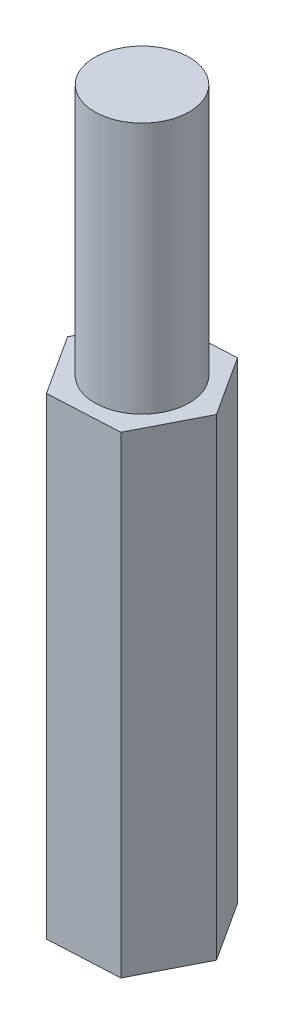
ISO-10303-21;
HEADER;
FILE_DESCRIPTION(('STEP AP214'),'2;1');
FILE_NAME('part.step','',(''),(''),'','','');
FILE_SCHEMA(('AUTOMOTIVE_DESIGN { 1 0 10303 214 1 1 1 1 }'));
ENDSEC;
DATA;
#1=APPLICATION_CONTEXT('core data for automotive mechanical design processes');
#2=APPLICATION_PROTOCOL_DEFINITION('international standard','automotive_design',2000,#1);
#3=PRODUCT_CONTEXT('',#1,'mechanical');
#4=PRODUCT('Part','Part','',(#3));
#5=PRODUCT_RELATED_PRODUCT_CATEGORY('part','',(#4));
#6=PRODUCT_DEFINITION_FORMATION('','',#4);
#7=PRODUCT_DEFINITION_CONTEXT('part definition',#1,'design');
#8=PRODUCT_DEFINITION('design','',#6,#7);
#9=PRODUCT_DEFINITION_SHAPE('','',#8);
#10=(LENGTH_UNIT() NAMED_UNIT(*) SI_UNIT(.MILLI.,.METRE.));
#11=(NAMED_UNIT(*) PLANE_ANGLE_UNIT() SI_UNIT($,.RADIAN.));
#12=(NAMED_UNIT(*) SI_UNIT($,.STERADIAN.) SOLID_ANGLE_UNIT());
#13=UNCERTAINTY_MEASURE_WITH_UNIT(LENGTH_MEASURE(1.E-05),#10,'distance_accuracy_value','');
#14=(GEOMETRIC_REPRESENTATION_CONTEXT(3) GLOBAL_UNCERTAINTY_ASSIGNED_CONTEXT((#13)) GLOBAL_UNIT_ASSIGNED_CONTEXT((#10,
#11,#12)) REPRESENTATION_CONTEXT('',''));
#15=CARTESIAN_POINT('',(0.,0.,0.));
#16=DIRECTION('',(0.,0.,1.));
#17=DIRECTION('',(1.,0.,0.));
#18=AXIS2_PLACEMENT_3D('',#15,#16,#17);
#19=CARTESIAN_POINT('',(-1.02671307262122,15.,2.00530314249495));
#20=DIRECTION('',(-0.0503768289351696,0.,-0.998730281460634));
#21=DIRECTION('',(-0.998730281460634,0.,0.0503768289351696));
#22=AXIS2_PLACEMENT_3D('',#19,#20,#21);
#23=PLANE('',#22);
#24=DIRECTION('',(0.998730281460634,0.,-0.0503768289351696));
#25=VECTOR('',#24,1.);
#26=CARTESIAN_POINT('',(-1.02671307262122,0.,2.00530314249495));
#27=LINE('',#26,#25);
#28=CARTESIAN_POINT('',(-1.02671307262122,0.,2.00530314249495));
#29=VERTEX_POINT('',#28);
#30=CARTESIAN_POINT('',(1.22328692737878,0.,1.89181117453503));
#31=VERTEX_POINT('',#30);
#32=EDGE_CURVE('E123',#29,#31,#27,.T.);
#33=ORIENTED_EDGE('',*,*,#32,.T.);
#34=DIRECTION('',(0.,-1.,0.));
#35=VECTOR('',#34,1.);
#36=CARTESIAN_POINT('',(1.22328692737878,15.,1.89181117453503));
#37=LINE('',#36,#35);
#38=CARTESIAN_POINT('',(1.22328692737878,15.,1.89181117453503));
#39=VERTEX_POINT('',#38);
#40=EDGE_CURVE('E40',#39,#31,#37,.T.);
#41=ORIENTED_EDGE('',*,*,#40,.F.);
#42=DIRECTION('',(0.998730281460634,0.,-0.0503768289351696));
#43=VECTOR('',#42,1.);
#44=CARTESIAN_POINT('',(-1.02671307262122,15.,2.00530314249495));
#45=LINE('',#44,#43);
#46=CARTESIAN_POINT('',(-1.02671307262122,15.,2.00530314249495));
#47=VERTEX_POINT('',#46);
#48=EDGE_CURVE('E134',#47,#39,#45,.T.);
#49=ORIENTED_EDGE('',*,*,#48,.F.);
#50=DIRECTION('',(0.,-1.,0.));
#51=VECTOR('',#50,1.);
#52=CARTESIAN_POINT('',(-1.02671307262122,15.,2.00530314249495));
#53=LINE('',#52,#51);
#54=EDGE_CURVE('E119',#47,#29,#53,.T.);
#55=ORIENTED_EDGE('',*,*,#54,.T.);
#56=EDGE_LOOP('',(#33,#41,#49,#55));
#57=FACE_BOUND('',#56,.T.);
#58=ADVANCED_FACE('F37',(#57),#23,.F.);
#59=CARTESIAN_POINT('',(1.22328692737878,15.,1.89181117453503));
#60=DIRECTION('',(-0.890114209741276,0.,-0.455737527110357));
#61=DIRECTION('',(-0.455737527110357,0.,0.890114209741276));
#62=AXIS2_PLACEMENT_3D('',#59,#60,#61);
#63=PLANE('',#62);
#64=DIRECTION('',(0.455737527110357,0.,-0.890114209741276));
#65=VECTOR('',#64,1.);
#66=CARTESIAN_POINT('',(1.22328692737878,0.,1.89181117453503));
#67=LINE('',#66,#65);
#68=CARTESIAN_POINT('',(2.25,0.,-0.11349196795992));
#69=VERTEX_POINT('',#68);
#70=EDGE_CURVE('E126',#31,#69,#67,.T.);
#71=ORIENTED_EDGE('',*,*,#70,.T.);
#72=DIRECTION('',(0.,-1.,0.));
#73=VECTOR('',#72,1.);
#74=CARTESIAN_POINT('',(2.25,15.,-0.11349196795992));
#75=LINE('',#74,#73);
#76=CARTESIAN_POINT('',(2.25,15.,-0.11349196795992));
#77=VERTEX_POINT('',#76);
#78=EDGE_CURVE('E137',#77,#69,#75,.T.);
#79=ORIENTED_EDGE('',*,*,#78,.F.);
#80=DIRECTION('',(0.455737527110357,0.,-0.890114209741276));
#81=VECTOR('',#80,1.);
#82=CARTESIAN_POINT('',(1.22328692737878,15.,1.89181117453503));
#83=LINE('',#82,#81);
#84=EDGE_CURVE('E92',#39,#77,#83,.T.);
#85=ORIENTED_EDGE('',*,*,#84,.F.);
#86=ORIENTED_EDGE('',*,*,#40,.T.);
#87=EDGE_LOOP('',(#71,#79,#85,#86));
#88=FACE_BOUND('',#87,.T.);
#89=ADVANCED_FACE('F142',(#88),#63,.F.);
#90=CARTESIAN_POINT('',(2.25,15.,-0.11349196795992));
#91=DIRECTION('',(-0.839737380806107,0.,0.542992754350277));
#92=DIRECTION('',(0.542992754350277,0.,0.839737380806107));
#93=AXIS2_PLACEMENT_3D('',#90,#91,#92);
#94=PLANE('',#93);
#95=DIRECTION('',(-0.542992754350277,0.,-0.839737380806106));
#96=VECTOR('',#95,1.);
#97=CARTESIAN_POINT('',(2.25,0.,-0.11349196795992));
#98=LINE('',#97,#96);
#99=CARTESIAN_POINT('',(1.02671307262122,0.,-2.00530314249495));
#100=VERTEX_POINT('',#99);
#101=EDGE_CURVE('E129',#69,#100,#98,.T.);
#102=ORIENTED_EDGE('',*,*,#101,.T.);
#103=DIRECTION('',(0.,-1.,0.));
#104=VECTOR('',#103,1.);
#105=CARTESIAN_POINT('',(1.02671307262122,15.,-2.00530314249495));
#106=LINE('',#105,#104);
#107=CARTESIAN_POINT('',(1.02671307262122,15.,-2.00530314249495));
#108=VERTEX_POINT('',#107);
#109=EDGE_CURVE('E114',#108,#100,#106,.T.);
#110=ORIENTED_EDGE('',*,*,#109,.F.);
#111=DIRECTION('',(-0.542992754350277,0.,-0.839737380806106));
#112=VECTOR('',#111,1.);
#113=CARTESIAN_POINT('',(2.25,15.,-0.11349196795992));
#114=LINE('',#113,#112);
#115=EDGE_CURVE('E105',#77,#108,#114,.T.);
#116=ORIENTED_EDGE('',*,*,#115,.F.);
#117=ORIENTED_EDGE('',*,*,#78,.T.);
#118=EDGE_LOOP('',(#102,#110,#116,#117));
#119=FACE_BOUND('',#118,.T.);
#120=ADVANCED_FACE('F148',(#119),#94,.F.);
#121=CARTESIAN_POINT('',(1.02671307262122,15.,-2.00530314249495));
#122=DIRECTION('',(0.0503768289351696,0.,0.998730281460634));
#123=DIRECTION('',(0.998730281460634,0.,-0.0503768289351696));
#124=AXIS2_PLACEMENT_3D('',#121,#122,#123);
#125=PLANE('',#124);
#126=DIRECTION('',(-0.998730281460634,0.,0.0503768289351695));
#127=VECTOR('',#126,1.);
#128=CARTESIAN_POINT('',(1.02671307262122,0.,-2.00530314249495));
#129=LINE('',#128,#127);
#130=CARTESIAN_POINT('',(-1.22328692737878,0.,-1.89181117453503));
#131=VERTEX_POINT('',#130);
#132=EDGE_CURVE('E113',#100,#131,#129,.T.);
#133=ORIENTED_EDGE('',*,*,#132,.T.);
#134=DIRECTION('',(0.,-1.,0.));
#135=VECTOR('',#134,1.);
#136=CARTESIAN_POINT('',(-1.22328692737878,15.,-1.89181117453503));
#137=LINE('',#136,#135);
#138=CARTESIAN_POINT('',(-1.22328692737878,15.,-1.89181117453503));
#139=VERTEX_POINT('',#138);
#140=EDGE_CURVE('E110',#139,#131,#137,.T.);
#141=ORIENTED_EDGE('',*,*,#140,.F.);
#142=DIRECTION('',(-0.998730281460634,0.,0.0503768289351695));
#143=VECTOR('',#142,1.);
#144=CARTESIAN_POINT('',(1.02671307262122,15.,-2.00530314249495));
#145=LINE('',#144,#143);
#146=EDGE_CURVE('E99',#108,#139,#145,.T.);
#147=ORIENTED_EDGE('',*,*,#146,.F.);
#148=ORIENTED_EDGE('',*,*,#109,.T.);
#149=EDGE_LOOP('',(#133,#141,#147,#148));
#150=FACE_BOUND('',#149,.T.);
#151=ADVANCED_FACE('F111',(#150),#125,.F.);
#152=CARTESIAN_POINT('',(-1.22328692737878,15.,-1.89181117453503));
#153=DIRECTION('',(0.890114209741276,0.,0.455737527110357));
#154=DIRECTION('',(0.455737527110357,0.,-0.890114209741276));
#155=AXIS2_PLACEMENT_3D('',#152,#153,#154);
#156=PLANE('',#155);
#157=DIRECTION('',(-0.455737527110357,0.,0.890114209741276));
#158=VECTOR('',#157,1.);
#159=CARTESIAN_POINT('',(-1.22328692737878,0.,-1.89181117453503));
#160=LINE('',#159,#158);
#161=CARTESIAN_POINT('',(-2.25,0.,0.113491967959919));
#162=VERTEX_POINT('',#161);
#163=EDGE_CURVE('E77',#131,#162,#160,.T.);
#164=ORIENTED_EDGE('',*,*,#163,.T.);
#165=DIRECTION('',(0.,-1.,0.));
#166=VECTOR('',#165,1.);
#167=CARTESIAN_POINT('',(-2.25,15.,0.113491967959919));
#168=LINE('',#167,#166);
#169=CARTESIAN_POINT('',(-2.25,15.,0.113491967959919));
#170=VERTEX_POINT('',#169);
#171=EDGE_CURVE('E115',#170,#162,#168,.T.);
#172=ORIENTED_EDGE('',*,*,#171,.F.);
#173=DIRECTION('',(-0.455737527110357,0.,0.890114209741276));
#174=VECTOR('',#173,1.);
#175=CARTESIAN_POINT('',(-1.22328692737878,15.,-1.89181117453503));
#176=LINE('',#175,#174);
#177=EDGE_CURVE('E103',#139,#170,#176,.T.);
#178=ORIENTED_EDGE('',*,*,#177,.F.);
#179=ORIENTED_EDGE('',*,*,#140,.T.);
#180=EDGE_LOOP('',(#164,#172,#178,#179));
#181=FACE_BOUND('',#180,.T.);
#182=ADVANCED_FACE('F117',(#181),#156,.F.);
#183=CARTESIAN_POINT('',(-2.25,15.,0.113491967959919));
#184=DIRECTION('',(0.839737380806107,0.,-0.542992754350276));
#185=DIRECTION('',(-0.542992754350277,0.,-0.839737380806107));
#186=AXIS2_PLACEMENT_3D('',#183,#184,#185);
#187=PLANE('',#186);
#188=DIRECTION('',(0.542992754350276,0.,0.839737380806107));
#189=VECTOR('',#188,1.);
#190=CARTESIAN_POINT('',(-2.25,0.,0.113491967959919));
#191=LINE('',#190,#189);
#192=EDGE_CURVE('E83',#162,#29,#191,.T.);
#193=ORIENTED_EDGE('',*,*,#192,.T.);
#194=ORIENTED_EDGE('',*,*,#54,.F.);
#195=DIRECTION('',(0.542992754350276,0.,0.839737380806107));
#196=VECTOR('',#195,1.);
#197=CARTESIAN_POINT('',(-2.25,15.,0.113491967959919));
#198=LINE('',#197,#196);
#199=EDGE_CURVE('E54',#170,#47,#198,.T.);
#200=ORIENTED_EDGE('',*,*,#199,.F.);
#201=ORIENTED_EDGE('',*,*,#171,.T.);
#202=EDGE_LOOP('',(#193,#194,#200,#201));
#203=FACE_BOUND('',#202,.T.);
#204=ADVANCED_FACE('F164',(#203),#187,.F.);
#205=CARTESIAN_POINT('',(0.,15.,0.));
#206=DIRECTION('',(0.,1.,0.));
#207=DIRECTION('',(0.,0.,1.));
#208=AXIS2_PLACEMENT_3D('',#205,#206,#207);
#209=PLANE('',#208);
#210=CARTESIAN_POINT('',(0.,15.,0.));
#211=DIRECTION('',(0.,1.,0.));
#212=DIRECTION('',(0.,0.,1.));
#213=AXIS2_PLACEMENT_3D('',#210,#211,#212);
#214=CIRCLE('',#213,1.5);
#215=CARTESIAN_POINT('',(0.,15.,1.5));
#216=VERTEX_POINT('',#215);
#217=EDGE_CURVE('E11',#216,#216,#214,.T.);
#218=ORIENTED_EDGE('',*,*,#217,.F.);
#219=EDGE_LOOP('',(#218));
#220=FACE_BOUND('',#219,.T.);
#221=ORIENTED_EDGE('',*,*,#48,.T.);
#222=ORIENTED_EDGE('',*,*,#84,.T.);
#223=ORIENTED_EDGE('',*,*,#115,.T.);
#224=ORIENTED_EDGE('',*,*,#146,.T.);
#225=ORIENTED_EDGE('',*,*,#177,.T.);
#226=ORIENTED_EDGE('',*,*,#199,.T.);
#227=EDGE_LOOP('',(#221,#222,#223,#224,#225,#226));
#228=FACE_BOUND('',#227,.T.);
#229=ADVANCED_FACE('F101',(#220,#228),#209,.T.);
#230=CARTESIAN_POINT('',(0.,0.,0.));
#231=DIRECTION('',(0.,1.,0.));
#232=DIRECTION('',(0.,0.,1.));
#233=AXIS2_PLACEMENT_3D('',#230,#231,#232);
#234=PLANE('',#233);
#235=ORIENTED_EDGE('',*,*,#32,.F.);
#236=ORIENTED_EDGE('',*,*,#192,.F.);
#237=ORIENTED_EDGE('',*,*,#163,.F.);
#238=ORIENTED_EDGE('',*,*,#132,.F.);
#239=ORIENTED_EDGE('',*,*,#101,.F.);
#240=ORIENTED_EDGE('',*,*,#70,.F.);
#241=EDGE_LOOP('',(#235,#236,#237,#238,#239,#240));
#242=FACE_BOUND('',#241,.T.);
#243=ADVANCED_FACE('F147',(#242),#234,.F.);
#244=CARTESIAN_POINT('',(0.,23.,0.));
#245=DIRECTION('',(0.,-1.,0.));
#246=DIRECTION('',(0.,0.,-1.));
#247=AXIS2_PLACEMENT_3D('',#244,#245,#246);
#248=CYLINDRICAL_SURFACE('',#247,1.5);
#249=CARTESIAN_POINT('',(0.,23.,0.));
#250=DIRECTION('',(0.,1.,0.));
#251=DIRECTION('',(0.,0.,1.));
#252=AXIS2_PLACEMENT_3D('',#249,#250,#251);
#253=CIRCLE('',#252,1.5);
#254=CARTESIAN_POINT('',(0.,23.,1.5));
#255=VERTEX_POINT('',#254);
#256=EDGE_CURVE('E127',#255,#255,#253,.T.);
#257=ORIENTED_EDGE('',*,*,#256,.F.);
#258=EDGE_LOOP('',(#257));
#259=FACE_BOUND('',#258,.T.);
#260=ORIENTED_EDGE('',*,*,#217,.T.);
#261=EDGE_LOOP('',(#260));
#262=FACE_BOUND('',#261,.T.);
#263=ADVANCED_FACE('F157',(#259,#262),#248,.T.);
#264=CARTESIAN_POINT('',(0.,23.,0.));
#265=DIRECTION('',(0.,1.,0.));
#266=DIRECTION('',(0.,0.,1.));
#267=AXIS2_PLACEMENT_3D('',#264,#265,#266);
#268=PLANE('',#267);
#269=ORIENTED_EDGE('',*,*,#256,.T.);
#270=EDGE_LOOP('',(#269));
#271=FACE_BOUND('',#270,.T.);
#272=ADVANCED_FACE('F155',(#271),#268,.T.);
#273=CLOSED_SHELL('',(#58,#89,#120,#151,#182,#204,#229,#243,#263,#272));
#274=MANIFOLD_SOLID_BREP('B2',#273);
#275=ADVANCED_BREP_SHAPE_REPRESENTATION('',(#18,#274),#14);
#276=SHAPE_DEFINITION_REPRESENTATION(#9,#275);
ENDSEC;
END-ISO-10303-21;
